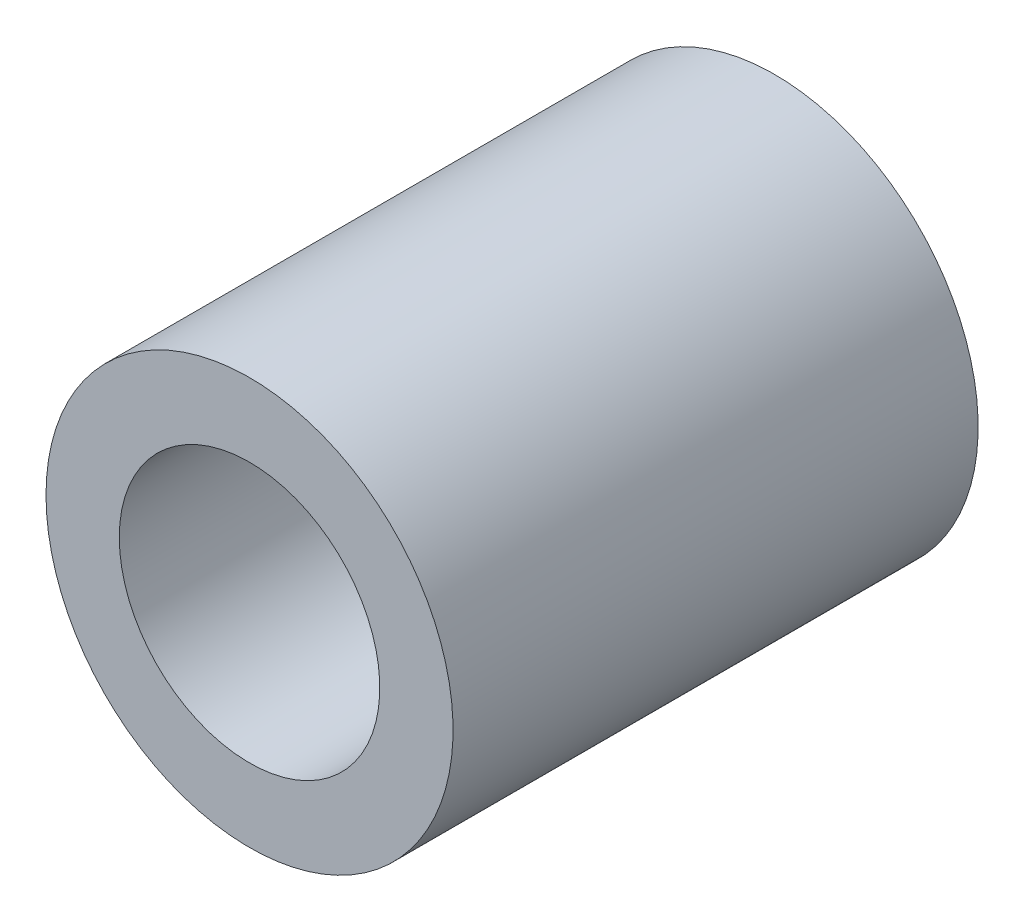
ISO-10303-21;
HEADER;
FILE_DESCRIPTION(('STEP AP214'),'2;1');
FILE_NAME('part.step','',(''),(''),'','','');
FILE_SCHEMA(('AUTOMOTIVE_DESIGN { 1 0 10303 214 1 1 1 1 }'));
ENDSEC;
DATA;
#1=APPLICATION_CONTEXT('core data for automotive mechanical design processes');
#2=APPLICATION_PROTOCOL_DEFINITION('international standard','automotive_design',2000,#1);
#3=PRODUCT_CONTEXT('',#1,'mechanical');
#4=PRODUCT('Part','Part','',(#3));
#5=PRODUCT_RELATED_PRODUCT_CATEGORY('part','',(#4));
#6=PRODUCT_DEFINITION_FORMATION('','',#4);
#7=PRODUCT_DEFINITION_CONTEXT('part definition',#1,'design');
#8=PRODUCT_DEFINITION('design','',#6,#7);
#9=PRODUCT_DEFINITION_SHAPE('','',#8);
#10=(LENGTH_UNIT() NAMED_UNIT(*) SI_UNIT(.MILLI.,.METRE.));
#11=(NAMED_UNIT(*) PLANE_ANGLE_UNIT() SI_UNIT($,.RADIAN.));
#12=(NAMED_UNIT(*) SI_UNIT($,.STERADIAN.) SOLID_ANGLE_UNIT());
#13=UNCERTAINTY_MEASURE_WITH_UNIT(LENGTH_MEASURE(1.E-05),#10,'distance_accuracy_value','');
#14=(GEOMETRIC_REPRESENTATION_CONTEXT(3) GLOBAL_UNCERTAINTY_ASSIGNED_CONTEXT((#13)) GLOBAL_UNIT_ASSIGNED_CONTEXT((#10,
#11,#12)) REPRESENTATION_CONTEXT('',''));
#15=CARTESIAN_POINT('',(0.,0.,0.));
#16=DIRECTION('',(0.,0.,1.));
#17=DIRECTION('',(1.,0.,0.));
#18=AXIS2_PLACEMENT_3D('',#15,#16,#17);
#19=CARTESIAN_POINT('',(0.,0.,0.));
#20=DIRECTION('',(0.,0.,1.));
#21=DIRECTION('',(1.,0.,0.));
#22=AXIS2_PLACEMENT_3D('',#19,#20,#21);
#23=PLANE('',#22);
#24=CARTESIAN_POINT('',(0.,0.,0.));
#25=DIRECTION('',(0.,0.,1.));
#26=DIRECTION('',(1.,0.,0.));
#27=AXIS2_PLACEMENT_3D('',#24,#25,#26);
#28=CIRCLE('',#27,2.5);
#29=CARTESIAN_POINT('',(-2.5,0.,0.));
#30=VERTEX_POINT('',#29);
#31=EDGE_CURVE('E40',#30,#30,#28,.T.);
#32=ORIENTED_EDGE('',*,*,#31,.F.);
#33=EDGE_LOOP('',(#32));
#34=FACE_BOUND('',#33,.T.);
#35=CARTESIAN_POINT('',(0.,0.,0.));
#36=DIRECTION('',(0.,0.,1.));
#37=DIRECTION('',(1.,0.,0.));
#38=AXIS2_PLACEMENT_3D('',#35,#36,#37);
#39=CIRCLE('',#38,1.6);
#40=CARTESIAN_POINT('',(-1.6,0.,0.));
#41=VERTEX_POINT('',#40);
#42=EDGE_CURVE('E49',#41,#41,#39,.T.);
#43=ORIENTED_EDGE('',*,*,#42,.T.);
#44=EDGE_LOOP('',(#43));
#45=FACE_BOUND('',#44,.T.);
#46=ADVANCED_FACE('F33',(#34,#45),#23,.F.);
#47=CARTESIAN_POINT('',(0.,0.,13.5210678118655));
#48=DIRECTION('',(0.,0.,-1.));
#49=DIRECTION('',(-1.,0.,0.));
#50=AXIS2_PLACEMENT_3D('',#47,#48,#49);
#51=CYLINDRICAL_SURFACE('',#50,2.5);
#52=CARTESIAN_POINT('',(0.,0.,6.44999999999998));
#53=DIRECTION('',(0.,0.,-1.));
#54=DIRECTION('',(-1.,0.,0.));
#55=AXIS2_PLACEMENT_3D('',#52,#53,#54);
#56=CIRCLE('',#55,2.5);
#57=CARTESIAN_POINT('',(-2.5,0.,6.44999999999998));
#58=VERTEX_POINT('',#57);
#59=EDGE_CURVE('E44',#58,#58,#56,.T.);
#60=CARTESIAN_POINT('',(-2.5,0.,6.44999999999998));
#61=CARTESIAN_POINT('',(-2.5,0.,6.38281249999998));
#62=CARTESIAN_POINT('',(-2.5,0.,6.31562499999998));
#63=CARTESIAN_POINT('',(-2.5,0.,6.18124999999999));
#64=CARTESIAN_POINT('',(-2.5,0.,6.11406249999999));
#65=CARTESIAN_POINT('',(-2.5,0.,5.97968749999999));
#66=CARTESIAN_POINT('',(-2.5,0.,5.91249999999999));
#67=CARTESIAN_POINT('',(-2.5,0.,5.77812499999999));
#68=CARTESIAN_POINT('',(-2.5,0.,5.71093749999999));
#69=CARTESIAN_POINT('',(-2.5,0.,5.57656249999999));
#70=CARTESIAN_POINT('',(-2.5,0.,5.50937499999999));
#71=CARTESIAN_POINT('',(-2.5,0.,5.37499999999999));
#72=CARTESIAN_POINT('',(-2.5,0.,5.30781249999999));
#73=CARTESIAN_POINT('',(-2.5,0.,5.17343749999999));
#74=CARTESIAN_POINT('',(-2.5,0.,5.10624999999999));
#75=CARTESIAN_POINT('',(-2.5,0.,4.97187499999999));
#76=CARTESIAN_POINT('',(-2.5,0.,4.90468749999999));
#77=CARTESIAN_POINT('',(-2.5,0.,4.77031249999999));
#78=CARTESIAN_POINT('',(-2.5,0.,4.70312499999999));
#79=CARTESIAN_POINT('',(-2.5,0.,4.56874999999999));
#80=CARTESIAN_POINT('',(-2.5,0.,4.50156249999999));
#81=CARTESIAN_POINT('',(-2.5,0.,4.36718749999999));
#82=CARTESIAN_POINT('',(-2.5,0.,4.29999999999999));
#83=CARTESIAN_POINT('',(-2.5,0.,4.16562499999999));
#84=CARTESIAN_POINT('',(-2.5,0.,4.09843749999999));
#85=CARTESIAN_POINT('',(-2.5,0.,3.96406249999999));
#86=CARTESIAN_POINT('',(-2.5,0.,3.89687499999999));
#87=CARTESIAN_POINT('',(-2.5,0.,3.76249999999999));
#88=CARTESIAN_POINT('',(-2.5,0.,3.69531249999999));
#89=CARTESIAN_POINT('',(-2.5,0.,3.56093749999999));
#90=CARTESIAN_POINT('',(-2.5,0.,3.49374999999999));
#91=CARTESIAN_POINT('',(-2.5,0.,3.35937499999999));
#92=CARTESIAN_POINT('',(-2.5,0.,3.29218749999999));
#93=CARTESIAN_POINT('',(-2.5,0.,3.15781249999999));
#94=CARTESIAN_POINT('',(-2.5,0.,3.09062499999999));
#95=CARTESIAN_POINT('',(-2.5,0.,2.95624999999999));
#96=CARTESIAN_POINT('',(-2.5,0.,2.88906249999999));
#97=CARTESIAN_POINT('',(-2.5,0.,2.75468749999999));
#98=CARTESIAN_POINT('',(-2.5,0.,2.68749999999999));
#99=CARTESIAN_POINT('',(-2.5,0.,2.55312499999999));
#100=CARTESIAN_POINT('',(-2.5,0.,2.48593749999999));
#101=CARTESIAN_POINT('',(-2.5,0.,2.35156249999999));
#102=CARTESIAN_POINT('',(-2.5,0.,2.28437499999999));
#103=CARTESIAN_POINT('',(-2.5,0.,2.14999999999999));
#104=CARTESIAN_POINT('',(-2.5,0.,2.08281249999999));
#105=CARTESIAN_POINT('',(-2.5,0.,1.94843749999999));
#106=CARTESIAN_POINT('',(-2.5,0.,1.88124999999999));
#107=CARTESIAN_POINT('',(-2.5,0.,1.74687499999999));
#108=CARTESIAN_POINT('',(-2.5,0.,1.67968749999999));
#109=CARTESIAN_POINT('',(-2.5,0.,1.54531249999999));
#110=CARTESIAN_POINT('',(-2.5,0.,1.478125));
#111=CARTESIAN_POINT('',(-2.5,0.,1.34375));
#112=CARTESIAN_POINT('',(-2.5,0.,1.2765625));
#113=CARTESIAN_POINT('',(-2.5,0.,1.1421875));
#114=CARTESIAN_POINT('',(-2.5,0.,1.075));
#115=CARTESIAN_POINT('',(-2.5,0.,0.940624999999996));
#116=CARTESIAN_POINT('',(-2.5,0.,0.873437499999996));
#117=CARTESIAN_POINT('',(-2.5,0.,0.739062499999997));
#118=CARTESIAN_POINT('',(-2.5,0.,0.671874999999997));
#119=CARTESIAN_POINT('',(-2.5,0.,0.537499999999997));
#120=CARTESIAN_POINT('',(-2.5,0.,0.470312499999997));
#121=CARTESIAN_POINT('',(-2.5,0.,0.335937499999997));
#122=CARTESIAN_POINT('',(-2.5,0.,0.268749999999997));
#123=CARTESIAN_POINT('',(-2.5,0.,0.134374999999997));
#124=CARTESIAN_POINT('',(-2.5,0.,0.0671874999999978));
#125=CARTESIAN_POINT('',(-2.5,0.,0.));
#126=B_SPLINE_CURVE_WITH_KNOTS('',3,(#60,#61,#62,#63,#64,#65,#66,#67,#68,#69,#70,#71,#72,#73,
#74,#75,#76,#77,#78,#79,#80,#81,#82,#83,#84,#85,#86,#87,#88,#89,#90,#91,#92,#93,#94,#95,#96,#97,
#98,#99,#100,#101,#102,#103,#104,#105,#106,#107,#108,#109,#110,#111,#112,#113,#114,#115,#116,
#117,#118,#119,#120,#121,#122,#123,#124,#125),.UNSPECIFIED.,.F.,.F.,(4,2,2,2,2,2,2,2,2,2,2,2,2,
2,2,2,2,2,2,2,2,2,2,2,2,2,2,2,2,2,2,2,4),(0.,0.201562499999999,0.403124999999999,
0.604687499999998,0.806249999999997,1.0078125,1.209375,1.4109375,1.61249999999999,1.8140625,
2.015625,2.21718749999999,2.41874999999999,2.62031249999999,2.82187499999999,3.02343749999999,
3.22499999999999,3.42656249999999,3.62812499999999,3.82968749999999,4.03124999999999,
4.23281249999999,4.43437499999999,4.63593749999999,4.83749999999999,5.03906249999999,
5.24062499999999,5.44218749999999,5.64374999999999,5.84531249999999,6.04687499999999,
6.24843749999999,6.44999999999999),.UNSPECIFIED.);
#127=EDGE_CURVE('BSEAM57',#58,#30,#126,.T.);
#128=ORIENTED_EDGE('',*,*,#59,.T.);
#129=ORIENTED_EDGE('',*,*,#31,.T.);
#130=ORIENTED_EDGE('',*,*,#127,.T.);
#131=ORIENTED_EDGE('',*,*,#127,.F.);
#132=EDGE_LOOP('',(#128,#130,#129,#131));
#133=FACE_BOUND('',#132,.T.);
#134=ADVANCED_FACE('F57',(#133),#51,.T.);
#135=CARTESIAN_POINT('',(0.,0.,13.5210678118655));
#136=DIRECTION('',(0.,0.,-1.));
#137=DIRECTION('',(-1.,0.,0.));
#138=AXIS2_PLACEMENT_3D('',#135,#136,#137);
#139=CYLINDRICAL_SURFACE('',#138,1.6);
#140=CARTESIAN_POINT('',(0.,0.,6.44999999999998));
#141=DIRECTION('',(0.,0.,-1.));
#142=DIRECTION('',(-1.,0.,0.));
#143=AXIS2_PLACEMENT_3D('',#140,#141,#142);
#144=CIRCLE('',#143,1.6);
#145=CARTESIAN_POINT('',(-1.6,0.,6.44999999999998));
#146=VERTEX_POINT('',#145);
#147=EDGE_CURVE('E10',#146,#146,#144,.T.);
#148=CARTESIAN_POINT('',(-1.6,0.,6.44999999999998));
#149=CARTESIAN_POINT('',(-1.6,0.,6.38281249999998));
#150=CARTESIAN_POINT('',(-1.6,0.,6.31562499999998));
#151=CARTESIAN_POINT('',(-1.6,0.,6.18124999999999));
#152=CARTESIAN_POINT('',(-1.6,0.,6.11406249999999));
#153=CARTESIAN_POINT('',(-1.6,0.,5.97968749999999));
#154=CARTESIAN_POINT('',(-1.6,0.,5.91249999999999));
#155=CARTESIAN_POINT('',(-1.6,0.,5.77812499999999));
#156=CARTESIAN_POINT('',(-1.6,0.,5.71093749999999));
#157=CARTESIAN_POINT('',(-1.6,0.,5.57656249999999));
#158=CARTESIAN_POINT('',(-1.6,0.,5.50937499999999));
#159=CARTESIAN_POINT('',(-1.6,0.,5.37499999999999));
#160=CARTESIAN_POINT('',(-1.6,0.,5.30781249999999));
#161=CARTESIAN_POINT('',(-1.6,0.,5.17343749999999));
#162=CARTESIAN_POINT('',(-1.6,0.,5.10624999999999));
#163=CARTESIAN_POINT('',(-1.6,0.,4.97187499999999));
#164=CARTESIAN_POINT('',(-1.6,0.,4.90468749999999));
#165=CARTESIAN_POINT('',(-1.6,0.,4.77031249999999));
#166=CARTESIAN_POINT('',(-1.6,0.,4.70312499999999));
#167=CARTESIAN_POINT('',(-1.6,0.,4.56874999999999));
#168=CARTESIAN_POINT('',(-1.6,0.,4.50156249999999));
#169=CARTESIAN_POINT('',(-1.6,0.,4.36718749999999));
#170=CARTESIAN_POINT('',(-1.6,0.,4.29999999999999));
#171=CARTESIAN_POINT('',(-1.6,0.,4.16562499999999));
#172=CARTESIAN_POINT('',(-1.6,0.,4.09843749999999));
#173=CARTESIAN_POINT('',(-1.6,0.,3.96406249999999));
#174=CARTESIAN_POINT('',(-1.6,0.,3.89687499999999));
#175=CARTESIAN_POINT('',(-1.6,0.,3.76249999999999));
#176=CARTESIAN_POINT('',(-1.6,0.,3.69531249999999));
#177=CARTESIAN_POINT('',(-1.6,0.,3.56093749999999));
#178=CARTESIAN_POINT('',(-1.6,0.,3.49374999999999));
#179=CARTESIAN_POINT('',(-1.6,0.,3.35937499999999));
#180=CARTESIAN_POINT('',(-1.6,0.,3.29218749999999));
#181=CARTESIAN_POINT('',(-1.6,0.,3.15781249999999));
#182=CARTESIAN_POINT('',(-1.6,0.,3.09062499999999));
#183=CARTESIAN_POINT('',(-1.6,0.,2.95624999999999));
#184=CARTESIAN_POINT('',(-1.6,0.,2.88906249999999));
#185=CARTESIAN_POINT('',(-1.6,0.,2.75468749999999));
#186=CARTESIAN_POINT('',(-1.6,0.,2.68749999999999));
#187=CARTESIAN_POINT('',(-1.6,0.,2.55312499999999));
#188=CARTESIAN_POINT('',(-1.6,0.,2.48593749999999));
#189=CARTESIAN_POINT('',(-1.6,0.,2.35156249999999));
#190=CARTESIAN_POINT('',(-1.6,0.,2.28437499999999));
#191=CARTESIAN_POINT('',(-1.6,0.,2.14999999999999));
#192=CARTESIAN_POINT('',(-1.6,0.,2.08281249999999));
#193=CARTESIAN_POINT('',(-1.6,0.,1.94843749999999));
#194=CARTESIAN_POINT('',(-1.6,0.,1.88124999999999));
#195=CARTESIAN_POINT('',(-1.6,0.,1.74687499999999));
#196=CARTESIAN_POINT('',(-1.6,0.,1.67968749999999));
#197=CARTESIAN_POINT('',(-1.6,0.,1.54531249999999));
#198=CARTESIAN_POINT('',(-1.6,0.,1.478125));
#199=CARTESIAN_POINT('',(-1.6,0.,1.34375));
#200=CARTESIAN_POINT('',(-1.6,0.,1.2765625));
#201=CARTESIAN_POINT('',(-1.6,0.,1.1421875));
#202=CARTESIAN_POINT('',(-1.6,0.,1.075));
#203=CARTESIAN_POINT('',(-1.6,0.,0.940624999999996));
#204=CARTESIAN_POINT('',(-1.6,0.,0.873437499999996));
#205=CARTESIAN_POINT('',(-1.6,0.,0.739062499999997));
#206=CARTESIAN_POINT('',(-1.6,0.,0.671874999999997));
#207=CARTESIAN_POINT('',(-1.6,0.,0.537499999999997));
#208=CARTESIAN_POINT('',(-1.6,0.,0.470312499999997));
#209=CARTESIAN_POINT('',(-1.6,0.,0.335937499999997));
#210=CARTESIAN_POINT('',(-1.6,0.,0.268749999999997));
#211=CARTESIAN_POINT('',(-1.6,0.,0.134374999999997));
#212=CARTESIAN_POINT('',(-1.6,0.,0.0671874999999978));
#213=CARTESIAN_POINT('',(-1.6,0.,0.));
#214=B_SPLINE_CURVE_WITH_KNOTS('',3,(#148,#149,#150,#151,#152,#153,#154,#155,#156,#157,#158,
#159,#160,#161,#162,#163,#164,#165,#166,#167,#168,#169,#170,#171,#172,#173,#174,#175,#176,#177,
#178,#179,#180,#181,#182,#183,#184,#185,#186,#187,#188,#189,#190,#191,#192,#193,#194,#195,#196,
#197,#198,#199,#200,#201,#202,#203,#204,#205,#206,#207,#208,#209,#210,#211,#212,#213),
.UNSPECIFIED.,.F.,.F.,(4,2,2,2,2,2,2,2,2,2,2,2,2,2,2,2,2,2,2,2,2,2,2,2,2,2,2,2,2,2,2,2,4),(0.,
0.201562499999999,0.403124999999999,0.604687499999998,0.806249999999997,1.0078125,1.209375,
1.4109375,1.61249999999999,1.8140625,2.015625,2.21718749999999,2.41874999999999,
2.62031249999999,2.82187499999999,3.02343749999999,3.22499999999999,3.42656249999999,
3.62812499999999,3.82968749999999,4.03124999999999,4.23281249999999,4.43437499999999,
4.63593749999999,4.83749999999999,5.03906249999999,5.24062499999999,5.44218749999999,
5.64374999999999,5.84531249999999,6.04687499999999,6.24843749999999,6.44999999999999),.UNSPECIFIED.);
#215=EDGE_CURVE('BSEAM55',#146,#41,#214,.T.);
#216=ORIENTED_EDGE('',*,*,#147,.F.);
#217=ORIENTED_EDGE('',*,*,#42,.F.);
#218=ORIENTED_EDGE('',*,*,#215,.T.);
#219=ORIENTED_EDGE('',*,*,#215,.F.);
#220=EDGE_LOOP('',(#216,#218,#217,#219));
#221=FACE_BOUND('',#220,.T.);
#222=ADVANCED_FACE('F55',(#221),#139,.F.);
#223=CARTESIAN_POINT('',(-31.1,19.6,6.44999999999998));
#224=DIRECTION('',(0.,0.,-1.));
#225=DIRECTION('',(-0.86602540378444,0.499999999999998,0.));
#226=AXIS2_PLACEMENT_3D('',#223,#224,#225);
#227=PLANE('',#226);
#228=ORIENTED_EDGE('',*,*,#147,.T.);
#229=EDGE_LOOP('',(#228));
#230=FACE_BOUND('',#229,.T.);
#231=ORIENTED_EDGE('',*,*,#59,.F.);
#232=EDGE_LOOP('',(#231));
#233=FACE_BOUND('',#232,.T.);
#234=ADVANCED_FACE('F35',(#230,#233),#227,.F.);
#235=CLOSED_SHELL('',(#46,#134,#222,#234));
#236=MANIFOLD_SOLID_BREP('B2',#235);
#237=ADVANCED_BREP_SHAPE_REPRESENTATION('',(#18,#236),#14);
#238=SHAPE_DEFINITION_REPRESENTATION(#9,#237);
ENDSEC;
END-ISO-10303-21;
